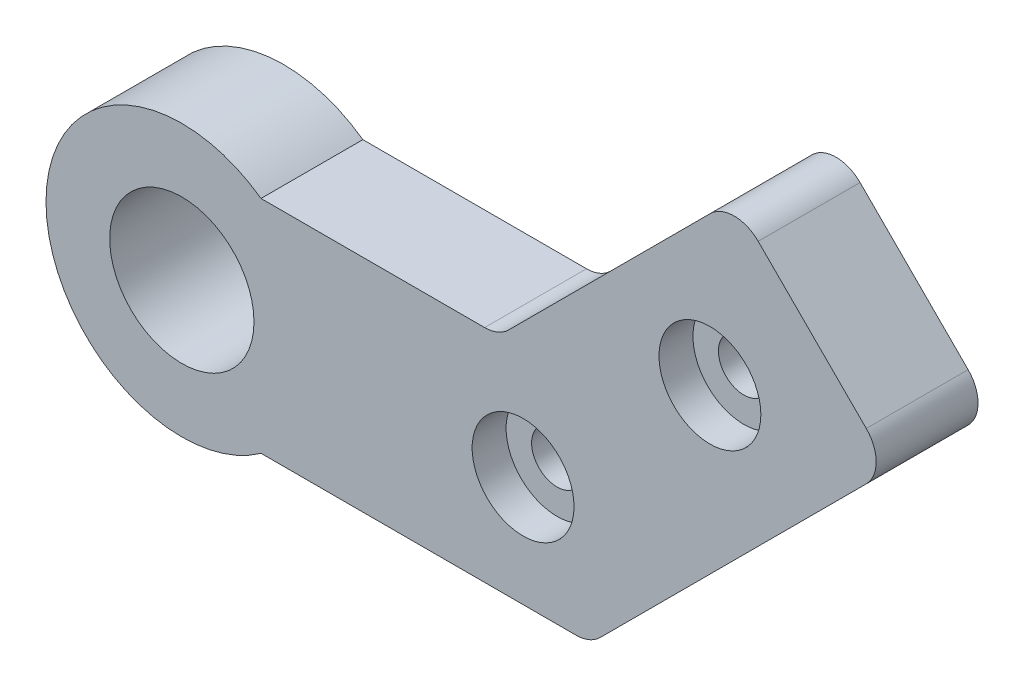
ISO-10303-21;
HEADER;
FILE_DESCRIPTION(('STEP AP214'),'2;1');
FILE_NAME('part.step','',(''),(''),'','','');
FILE_SCHEMA(('AUTOMOTIVE_DESIGN { 1 0 10303 214 1 1 1 1 }'));
ENDSEC;
DATA;
#1=APPLICATION_CONTEXT('core data for automotive mechanical design processes');
#2=APPLICATION_PROTOCOL_DEFINITION('international standard','automotive_design',2000,#1);
#3=PRODUCT_CONTEXT('',#1,'mechanical');
#4=PRODUCT('Part','Part','',(#3));
#5=PRODUCT_RELATED_PRODUCT_CATEGORY('part','',(#4));
#6=PRODUCT_DEFINITION_FORMATION('','',#4);
#7=PRODUCT_DEFINITION_CONTEXT('part definition',#1,'design');
#8=PRODUCT_DEFINITION('design','',#6,#7);
#9=PRODUCT_DEFINITION_SHAPE('','',#8);
#10=(LENGTH_UNIT() NAMED_UNIT(*) SI_UNIT(.MILLI.,.METRE.));
#11=(NAMED_UNIT(*) PLANE_ANGLE_UNIT() SI_UNIT($,.RADIAN.));
#12=(NAMED_UNIT(*) SI_UNIT($,.STERADIAN.) SOLID_ANGLE_UNIT());
#13=UNCERTAINTY_MEASURE_WITH_UNIT(LENGTH_MEASURE(1.E-05),#10,'distance_accuracy_value','');
#14=(GEOMETRIC_REPRESENTATION_CONTEXT(3) GLOBAL_UNCERTAINTY_ASSIGNED_CONTEXT((#13)) GLOBAL_UNIT_ASSIGNED_CONTEXT((#10,
#11,#12)) REPRESENTATION_CONTEXT('',''));
#15=CARTESIAN_POINT('',(0.,0.,0.));
#16=DIRECTION('',(0.,0.,1.));
#17=DIRECTION('',(1.,0.,0.));
#18=AXIS2_PLACEMENT_3D('',#15,#16,#17);
#19=CARTESIAN_POINT('',(9.72889778547104,9.35031688535954,0.));
#20=DIRECTION('',(0.,0.,1.));
#21=DIRECTION('',(1.,0.,0.));
#22=AXIS2_PLACEMENT_3D('',#19,#20,#21);
#23=CYLINDRICAL_SURFACE('',#22,1.5);
#24=CARTESIAN_POINT('',(9.72889778547104,9.35031688535954,0.));
#25=DIRECTION('',(0.,0.,1.));
#26=DIRECTION('',(1.,0.,0.));
#27=AXIS2_PLACEMENT_3D('',#24,#25,#26);
#28=CIRCLE('',#27,1.5);
#29=CARTESIAN_POINT('',(11.228897785471,9.35031688535954,0.));
#30=VERTEX_POINT('',#29);
#31=EDGE_CURVE('E177',#30,#30,#28,.T.);
#32=ORIENTED_EDGE('',*,*,#31,.F.);
#33=EDGE_LOOP('',(#32));
#34=FACE_BOUND('',#33,.T.);
#35=CARTESIAN_POINT('',(9.72889778547104,9.35031688535954,4.));
#36=DIRECTION('',(0.,0.,1.));
#37=DIRECTION('',(1.,0.,0.));
#38=AXIS2_PLACEMENT_3D('',#35,#36,#37);
#39=CIRCLE('',#38,1.5);
#40=CARTESIAN_POINT('',(11.228897785471,9.35031688535954,4.));
#41=VERTEX_POINT('',#40);
#42=EDGE_CURVE('E39',#41,#41,#39,.F.);
#43=ORIENTED_EDGE('',*,*,#42,.F.);
#44=EDGE_LOOP('',(#43));
#45=FACE_BOUND('',#44,.T.);
#46=ADVANCED_FACE('F35',(#34,#45),#23,.F.);
#47=CARTESIAN_POINT('',(-1.2757727680621,-0.842681986817409,0.));
#48=DIRECTION('',(0.,0.,1.));
#49=DIRECTION('',(1.,0.,0.));
#50=AXIS2_PLACEMENT_3D('',#47,#48,#49);
#51=CYLINDRICAL_SURFACE('',#50,1.5);
#52=CARTESIAN_POINT('',(-1.2757727680621,-0.842681986817409,0.));
#53=DIRECTION('',(0.,0.,1.));
#54=DIRECTION('',(1.,0.,0.));
#55=AXIS2_PLACEMENT_3D('',#52,#53,#54);
#56=CIRCLE('',#55,1.5);
#57=CARTESIAN_POINT('',(0.224227231937896,-0.842681986817409,0.));
#58=VERTEX_POINT('',#57);
#59=EDGE_CURVE('E182',#58,#58,#56,.T.);
#60=ORIENTED_EDGE('',*,*,#59,.F.);
#61=EDGE_LOOP('',(#60));
#62=FACE_BOUND('',#61,.T.);
#63=CARTESIAN_POINT('',(-1.2757727680621,-0.842681986817409,4.));
#64=DIRECTION('',(0.,0.,1.));
#65=DIRECTION('',(1.,0.,0.));
#66=AXIS2_PLACEMENT_3D('',#63,#64,#65);
#67=CIRCLE('',#66,1.5);
#68=CARTESIAN_POINT('',(0.224227231937896,-0.842681986817409,4.));
#69=VERTEX_POINT('',#68);
#70=EDGE_CURVE('E175',#69,#69,#67,.F.);
#71=ORIENTED_EDGE('',*,*,#70,.F.);
#72=EDGE_LOOP('',(#71));
#73=FACE_BOUND('',#72,.T.);
#74=ADVANCED_FACE('F259',(#62,#73),#51,.F.);
#75=CARTESIAN_POINT('',(-21.3757727680621,-0.84268198681741,6.));
#76=DIRECTION('',(0.,0.,-1.));
#77=DIRECTION('',(-1.,0.,0.));
#78=AXIS2_PLACEMENT_3D('',#75,#76,#77);
#79=CYLINDRICAL_SURFACE('',#78,8.);
#80=CARTESIAN_POINT('',(-21.3757727680621,-0.84268198681741,0.));
#81=DIRECTION('',(0.,0.,1.));
#82=DIRECTION('',(1.,0.,0.));
#83=AXIS2_PLACEMENT_3D('',#80,#81,#82);
#84=CIRCLE('',#83,8.);
#85=CARTESIAN_POINT('',(-16.7120832415177,5.65731801318259,0.));
#86=VERTEX_POINT('',#85);
#87=CARTESIAN_POINT('',(-16.7120832415177,-7.34268198681741,0.));
#88=VERTEX_POINT('',#87);
#89=EDGE_CURVE('E139',#86,#88,#84,.T.);
#90=ORIENTED_EDGE('',*,*,#89,.T.);
#91=DIRECTION('',(0.,0.,-1.));
#92=VECTOR('',#91,1.);
#93=CARTESIAN_POINT('',(-16.7120832415177,-7.34268198681741,6.));
#94=LINE('',#93,#92);
#95=CARTESIAN_POINT('',(-16.7120832415177,-7.34268198681741,6.));
#96=VERTEX_POINT('',#95);
#97=EDGE_CURVE('E120',#96,#88,#94,.T.);
#98=ORIENTED_EDGE('',*,*,#97,.F.);
#99=CARTESIAN_POINT('',(-21.3757727680621,-0.84268198681741,6.));
#100=DIRECTION('',(0.,0.,1.));
#101=DIRECTION('',(1.,0.,0.));
#102=AXIS2_PLACEMENT_3D('',#99,#100,#101);
#103=CIRCLE('',#102,8.);
#104=CARTESIAN_POINT('',(-16.7120832415177,5.65731801318259,6.));
#105=VERTEX_POINT('',#104);
#106=EDGE_CURVE('E126',#105,#96,#103,.T.);
#107=ORIENTED_EDGE('',*,*,#106,.F.);
#108=DIRECTION('',(0.,0.,-1.));
#109=VECTOR('',#108,1.);
#110=CARTESIAN_POINT('',(-16.7120832415177,5.65731801318259,6.));
#111=LINE('',#110,#109);
#112=EDGE_CURVE('E141',#105,#86,#111,.T.);
#113=ORIENTED_EDGE('',*,*,#112,.T.);
#114=EDGE_LOOP('',(#90,#98,#107,#113));
#115=FACE_BOUND('',#114,.T.);
#116=ADVANCED_FACE('F137',(#115),#79,.T.);
#117=CARTESIAN_POINT('',(-16.7120832415177,-7.34268198681741,6.));
#118=DIRECTION('',(0.,1.,0.));
#119=DIRECTION('',(-1.,0.,0.));
#120=AXIS2_PLACEMENT_3D('',#117,#118,#119);
#121=PLANE('',#120);
#122=DIRECTION('',(1.,0.,0.));
#123=VECTOR('',#122,1.);
#124=CARTESIAN_POINT('',(-16.7120832415177,-7.34268198681741,0.));
#125=LINE('',#124,#123);
#126=CARTESIAN_POINT('',(1.84426594458633,-7.34268198681741,0.));
#127=VERTEX_POINT('',#126);
#128=EDGE_CURVE('E210',#88,#127,#125,.T.);
#129=ORIENTED_EDGE('',*,*,#128,.T.);
#130=DIRECTION('',(0.,0.,-1.));
#131=VECTOR('',#130,1.);
#132=CARTESIAN_POINT('',(1.84426594458634,-7.34268198681741,6.));
#133=LINE('',#132,#131);
#134=CARTESIAN_POINT('',(1.84426594458633,-7.34268198681741,6.));
#135=VERTEX_POINT('',#134);
#136=EDGE_CURVE('E123',#127,#135,#133,.F.);
#137=ORIENTED_EDGE('',*,*,#136,.T.);
#138=DIRECTION('',(1.,0.,0.));
#139=VECTOR('',#138,1.);
#140=CARTESIAN_POINT('',(-16.7120832415177,-7.34268198681741,6.));
#141=LINE('',#140,#139);
#142=EDGE_CURVE('E115',#96,#135,#141,.T.);
#143=ORIENTED_EDGE('',*,*,#142,.F.);
#144=ORIENTED_EDGE('',*,*,#97,.T.);
#145=EDGE_LOOP('',(#129,#137,#143,#144));
#146=FACE_BOUND('',#145,.T.);
#147=ADVANCED_FACE('F118',(#146),#121,.F.);
#148=CARTESIAN_POINT('',(2.67269306933252,-7.34268198681741,6.));
#149=DIRECTION('',(-0.707106781186546,0.707106781186549,0.));
#150=DIRECTION('',(-0.707106781186549,-0.707106781186546,0.));
#151=AXIS2_PLACEMENT_3D('',#148,#149,#150);
#152=PLANE('',#151);
#153=DIRECTION('',(0.707106781186549,0.707106781186546,0.));
#154=VECTOR('',#153,1.);
#155=CARTESIAN_POINT('',(2.67269306933252,-7.34268198681741,0.));
#156=LINE('',#155,#154);
#157=CARTESIAN_POINT('',(3.25847950695943,-6.75689554919051,0.));
#158=VERTEX_POINT('',#157);
#159=CARTESIAN_POINT('',(18.9361490366231,8.92077398047315,0.));
#160=VERTEX_POINT('',#159);
#161=EDGE_CURVE('E212',#158,#160,#156,.T.);
#162=ORIENTED_EDGE('',*,*,#161,.T.);
#163=DIRECTION('',(0.,0.,-1.));
#164=VECTOR('',#163,1.);
#165=CARTESIAN_POINT('',(18.9361490366231,8.92077398047316,6.));
#166=LINE('',#165,#164);
#167=CARTESIAN_POINT('',(18.9361490366231,8.92077398047315,6.));
#168=VERTEX_POINT('',#167);
#169=EDGE_CURVE('E58',#160,#168,#166,.F.);
#170=ORIENTED_EDGE('',*,*,#169,.T.);
#171=DIRECTION('',(0.707106781186549,0.707106781186546,0.));
#172=VECTOR('',#171,1.);
#173=CARTESIAN_POINT('',(2.67269306933252,-7.34268198681741,6.));
#174=LINE('',#173,#172);
#175=CARTESIAN_POINT('',(3.25847950695943,-6.75689554919051,6.));
#176=VERTEX_POINT('',#175);
#177=EDGE_CURVE('E125',#176,#168,#174,.T.);
#178=ORIENTED_EDGE('',*,*,#177,.F.);
#179=DIRECTION('',(0.,0.,-1.));
#180=VECTOR('',#179,1.);
#181=CARTESIAN_POINT('',(3.25847950695943,-6.75689554919051,6.));
#182=LINE('',#181,#180);
#183=EDGE_CURVE('E167',#176,#158,#182,.T.);
#184=ORIENTED_EDGE('',*,*,#183,.T.);
#185=EDGE_LOOP('',(#162,#170,#178,#184));
#186=FACE_BOUND('',#185,.T.);
#187=ADVANCED_FACE('F231',(#186),#152,.F.);
#188=CARTESIAN_POINT('',(11.1579744435711,19.5273756982714,6.));
#189=DIRECTION('',(-0.707106781186549,-0.707106781186546,0.));
#190=DIRECTION('',(0.707106781186546,-0.707106781186549,0.));
#191=AXIS2_PLACEMENT_3D('',#188,#189,#190);
#192=PLANE('',#191);
#193=DIRECTION('',(-0.707106781186546,0.707106781186549,0.));
#194=VECTOR('',#193,1.);
#195=CARTESIAN_POINT('',(11.1579744435711,19.5273756982714,0.));
#196=LINE('',#195,#194);
#197=CARTESIAN_POINT('',(18.9361490366231,11.7492011052193,0.));
#198=VERTEX_POINT('',#197);
#199=CARTESIAN_POINT('',(12.5721880059442,18.1131621358983,0.));
#200=VERTEX_POINT('',#199);
#201=EDGE_CURVE('E214',#198,#200,#196,.T.);
#202=ORIENTED_EDGE('',*,*,#201,.T.);
#203=DIRECTION('',(0.,0.,-1.));
#204=VECTOR('',#203,1.);
#205=CARTESIAN_POINT('',(12.5721880059442,18.1131621358983,6.));
#206=LINE('',#205,#204);
#207=CARTESIAN_POINT('',(12.5721880059442,18.1131621358983,6.));
#208=VERTEX_POINT('',#207);
#209=EDGE_CURVE('E159',#200,#208,#206,.F.);
#210=ORIENTED_EDGE('',*,*,#209,.T.);
#211=DIRECTION('',(-0.707106781186546,0.707106781186549,0.));
#212=VECTOR('',#211,1.);
#213=CARTESIAN_POINT('',(11.1579744435711,19.5273756982714,6.));
#214=LINE('',#213,#212);
#215=CARTESIAN_POINT('',(18.9361490366231,11.7492011052193,6.));
#216=VERTEX_POINT('',#215);
#217=EDGE_CURVE('E204',#216,#208,#214,.T.);
#218=ORIENTED_EDGE('',*,*,#217,.F.);
#219=DIRECTION('',(0.,0.,-1.));
#220=VECTOR('',#219,1.);
#221=CARTESIAN_POINT('',(18.9361490366231,11.7492011052193,6.));
#222=LINE('',#221,#220);
#223=EDGE_CURVE('E156',#216,#198,#222,.T.);
#224=ORIENTED_EDGE('',*,*,#223,.T.);
#225=EDGE_LOOP('',(#202,#210,#218,#224));
#226=FACE_BOUND('',#225,.T.);
#227=ADVANCED_FACE('F238',(#226),#192,.F.);
#228=CARTESIAN_POINT('',(-2.7120832415177,5.65731801318259,6.));
#229=DIRECTION('',(0.707106781186546,-0.707106781186549,0.));
#230=DIRECTION('',(0.707106781186549,0.707106781186546,0.));
#231=AXIS2_PLACEMENT_3D('',#228,#229,#230);
#232=PLANE('',#231);
#233=DIRECTION('',(-0.707106781186549,-0.707106781186546,0.));
#234=VECTOR('',#233,1.);
#235=CARTESIAN_POINT('',(-2.7120832415177,5.65731801318259,6.));
#236=LINE('',#235,#234);
#237=CARTESIAN_POINT('',(9.74376088119804,18.1131621358983,6.));
#238=VERTEX_POINT('',#237);
#239=CARTESIAN_POINT('',(-2.12629680389079,6.24310445080949,6.));
#240=VERTEX_POINT('',#239);
#241=EDGE_CURVE('E206',#238,#240,#236,.T.);
#242=ORIENTED_EDGE('',*,*,#241,.F.);
#243=DIRECTION('',(0.,0.,-1.));
#244=VECTOR('',#243,1.);
#245=CARTESIAN_POINT('',(9.74376088119804,18.1131621358983,6.));
#246=LINE('',#245,#244);
#247=CARTESIAN_POINT('',(9.74376088119804,18.1131621358983,0.));
#248=VERTEX_POINT('',#247);
#249=EDGE_CURVE('E143',#238,#248,#246,.T.);
#250=ORIENTED_EDGE('',*,*,#249,.T.);
#251=DIRECTION('',(-0.707106781186549,-0.707106781186546,0.));
#252=VECTOR('',#251,1.);
#253=CARTESIAN_POINT('',(-2.7120832415177,5.65731801318259,0.));
#254=LINE('',#253,#252);
#255=CARTESIAN_POINT('',(-2.12629680389079,6.24310445080949,0.));
#256=VERTEX_POINT('',#255);
#257=EDGE_CURVE('E217',#248,#256,#254,.T.);
#258=ORIENTED_EDGE('',*,*,#257,.T.);
#259=DIRECTION('',(0.,0.,-1.));
#260=VECTOR('',#259,1.);
#261=CARTESIAN_POINT('',(-2.12629680389079,6.24310445080949,6.));
#262=LINE('',#261,#260);
#263=EDGE_CURVE('E140',#256,#240,#262,.F.);
#264=ORIENTED_EDGE('',*,*,#263,.T.);
#265=EDGE_LOOP('',(#242,#250,#258,#264));
#266=FACE_BOUND('',#265,.T.);
#267=ADVANCED_FACE('F246',(#266),#232,.F.);
#268=CARTESIAN_POINT('',(-16.7120832415177,5.65731801318259,6.));
#269=DIRECTION('',(0.,-1.,0.));
#270=DIRECTION('',(0.,0.,-1.));
#271=AXIS2_PLACEMENT_3D('',#268,#269,#270);
#272=PLANE('',#271);
#273=DIRECTION('',(-1.,0.,0.));
#274=VECTOR('',#273,1.);
#275=CARTESIAN_POINT('',(-16.7120832415177,5.65731801318259,6.));
#276=LINE('',#275,#274);
#277=CARTESIAN_POINT('',(-3.54051036626388,5.65731801318259,6.));
#278=VERTEX_POINT('',#277);
#279=EDGE_CURVE('E131',#278,#105,#276,.T.);
#280=ORIENTED_EDGE('',*,*,#279,.F.);
#281=DIRECTION('',(0.,0.,-1.));
#282=VECTOR('',#281,1.);
#283=CARTESIAN_POINT('',(-3.54051036626388,5.65731801318259,0.));
#284=LINE('',#283,#282);
#285=CARTESIAN_POINT('',(-3.54051036626388,5.65731801318259,0.));
#286=VERTEX_POINT('',#285);
#287=EDGE_CURVE('E172',#278,#286,#284,.T.);
#288=ORIENTED_EDGE('',*,*,#287,.T.);
#289=DIRECTION('',(-1.,0.,0.));
#290=VECTOR('',#289,1.);
#291=CARTESIAN_POINT('',(-16.7120832415177,5.65731801318259,0.));
#292=LINE('',#291,#290);
#293=EDGE_CURVE('E135',#286,#86,#292,.T.);
#294=ORIENTED_EDGE('',*,*,#293,.T.);
#295=ORIENTED_EDGE('',*,*,#112,.F.);
#296=EDGE_LOOP('',(#280,#288,#294,#295));
#297=FACE_BOUND('',#296,.T.);
#298=ADVANCED_FACE('F221',(#297),#272,.F.);
#299=CARTESIAN_POINT('',(-21.3757727680621,-0.84268198681741,6.));
#300=DIRECTION('',(0.,0.,1.));
#301=DIRECTION('',(1.,0.,0.));
#302=AXIS2_PLACEMENT_3D('',#299,#300,#301);
#303=PLANE('',#302);
#304=CARTESIAN_POINT('',(9.72889778547104,9.35031688535954,6.));
#305=DIRECTION('',(0.,0.,1.));
#306=DIRECTION('',(1.,0.,0.));
#307=AXIS2_PLACEMENT_3D('',#304,#305,#306);
#308=CIRCLE('',#307,3.);
#309=CARTESIAN_POINT('',(12.728897785471,9.35031688535954,6.));
#310=VERTEX_POINT('',#309);
#311=EDGE_CURVE('E192',#310,#310,#308,.T.);
#312=ORIENTED_EDGE('',*,*,#311,.F.);
#313=EDGE_LOOP('',(#312));
#314=FACE_BOUND('',#313,.T.);
#315=CARTESIAN_POINT('',(-1.2757727680621,-0.842681986817409,6.));
#316=DIRECTION('',(0.,0.,1.));
#317=DIRECTION('',(1.,0.,0.));
#318=AXIS2_PLACEMENT_3D('',#315,#316,#317);
#319=CIRCLE('',#318,3.);
#320=CARTESIAN_POINT('',(1.7242272319379,-0.842681986817409,6.));
#321=VERTEX_POINT('',#320);
#322=EDGE_CURVE('E185',#321,#321,#319,.T.);
#323=ORIENTED_EDGE('',*,*,#322,.F.);
#324=EDGE_LOOP('',(#323));
#325=FACE_BOUND('',#324,.T.);
#326=CARTESIAN_POINT('',(-21.3757727680621,-0.842681986817409,6.));
#327=DIRECTION('',(0.,0.,1.));
#328=DIRECTION('',(1.,0.,0.));
#329=AXIS2_PLACEMENT_3D('',#326,#327,#328);
#330=CIRCLE('',#329,4.25);
#331=CARTESIAN_POINT('',(-17.1257727680621,-0.842681986817409,6.));
#332=VERTEX_POINT('',#331);
#333=EDGE_CURVE('E197',#332,#332,#330,.T.);
#334=ORIENTED_EDGE('',*,*,#333,.F.);
#335=EDGE_LOOP('',(#334));
#336=FACE_BOUND('',#335,.T.);
#337=ORIENTED_EDGE('',*,*,#217,.T.);
#338=CARTESIAN_POINT('',(11.1579744435711,16.6989485735252,6.));
#339=DIRECTION('',(0.,0.,1.));
#340=DIRECTION('',(1.,0.,0.));
#341=AXIS2_PLACEMENT_3D('',#338,#339,#340);
#342=CIRCLE('',#341,2.);
#343=EDGE_CURVE('E165',#208,#238,#342,.T.);
#344=ORIENTED_EDGE('',*,*,#343,.T.);
#345=ORIENTED_EDGE('',*,*,#241,.T.);
#346=CARTESIAN_POINT('',(-3.54051036626388,7.65731801318259,6.));
#347=DIRECTION('',(0.,0.,1.));
#348=DIRECTION('',(1.,0.,0.));
#349=AXIS2_PLACEMENT_3D('',#346,#347,#348);
#350=CIRCLE('',#349,2.);
#351=EDGE_CURVE('E11',#240,#278,#350,.F.);
#352=ORIENTED_EDGE('',*,*,#351,.T.);
#353=ORIENTED_EDGE('',*,*,#279,.T.);
#354=ORIENTED_EDGE('',*,*,#106,.T.);
#355=ORIENTED_EDGE('',*,*,#142,.T.);
#356=CARTESIAN_POINT('',(1.84426594458634,-5.34268198681741,6.));
#357=DIRECTION('',(0.,0.,1.));
#358=DIRECTION('',(1.,0.,0.));
#359=AXIS2_PLACEMENT_3D('',#356,#357,#358);
#360=CIRCLE('',#359,2.);
#361=EDGE_CURVE('E161',#135,#176,#360,.T.);
#362=ORIENTED_EDGE('',*,*,#361,.T.);
#363=ORIENTED_EDGE('',*,*,#177,.T.);
#364=CARTESIAN_POINT('',(17.52193547425,10.3349875428463,6.));
#365=DIRECTION('',(0.,0.,1.));
#366=DIRECTION('',(1.,0.,0.));
#367=AXIS2_PLACEMENT_3D('',#364,#365,#366);
#368=CIRCLE('',#367,2.);
#369=EDGE_CURVE('E163',#168,#216,#368,.T.);
#370=ORIENTED_EDGE('',*,*,#369,.T.);
#371=EDGE_LOOP('',(#337,#344,#345,#352,#353,#354,#355,#362,#363,#370));
#372=FACE_BOUND('',#371,.T.);
#373=ADVANCED_FACE('F130',(#314,#325,#336,#372),#303,.T.);
#374=CARTESIAN_POINT('',(-21.3757727680621,-0.84268198681741,0.));
#375=DIRECTION('',(0.,0.,1.));
#376=DIRECTION('',(1.,0.,0.));
#377=AXIS2_PLACEMENT_3D('',#374,#375,#376);
#378=PLANE('',#377);
#379=ORIENTED_EDGE('',*,*,#31,.T.);
#380=EDGE_LOOP('',(#379));
#381=FACE_BOUND('',#380,.T.);
#382=ORIENTED_EDGE('',*,*,#59,.T.);
#383=EDGE_LOOP('',(#382));
#384=FACE_BOUND('',#383,.T.);
#385=CARTESIAN_POINT('',(-21.3757727680621,-0.842681986817409,0.));
#386=DIRECTION('',(0.,0.,1.));
#387=DIRECTION('',(1.,0.,0.));
#388=AXIS2_PLACEMENT_3D('',#385,#386,#387);
#389=CIRCLE('',#388,4.25);
#390=CARTESIAN_POINT('',(-17.1257727680621,-0.842681986817409,0.));
#391=VERTEX_POINT('',#390);
#392=EDGE_CURVE('E198',#391,#391,#389,.T.);
#393=ORIENTED_EDGE('',*,*,#392,.T.);
#394=EDGE_LOOP('',(#393));
#395=FACE_BOUND('',#394,.T.);
#396=ORIENTED_EDGE('',*,*,#257,.F.);
#397=CARTESIAN_POINT('',(11.1579744435711,16.6989485735252,0.));
#398=DIRECTION('',(0.,0.,1.));
#399=DIRECTION('',(1.,0.,0.));
#400=AXIS2_PLACEMENT_3D('',#397,#398,#399);
#401=CIRCLE('',#400,2.);
#402=EDGE_CURVE('E154',#248,#200,#401,.F.);
#403=ORIENTED_EDGE('',*,*,#402,.T.);
#404=ORIENTED_EDGE('',*,*,#201,.F.);
#405=CARTESIAN_POINT('',(17.52193547425,10.3349875428463,0.));
#406=DIRECTION('',(0.,0.,1.));
#407=DIRECTION('',(1.,0.,0.));
#408=AXIS2_PLACEMENT_3D('',#405,#406,#407);
#409=CIRCLE('',#408,2.);
#410=EDGE_CURVE('E152',#198,#160,#409,.F.);
#411=ORIENTED_EDGE('',*,*,#410,.T.);
#412=ORIENTED_EDGE('',*,*,#161,.F.);
#413=CARTESIAN_POINT('',(1.84426594458634,-5.34268198681741,0.));
#414=DIRECTION('',(0.,0.,1.));
#415=DIRECTION('',(1.,0.,0.));
#416=AXIS2_PLACEMENT_3D('',#413,#414,#415);
#417=CIRCLE('',#416,2.);
#418=EDGE_CURVE('E150',#158,#127,#417,.F.);
#419=ORIENTED_EDGE('',*,*,#418,.T.);
#420=ORIENTED_EDGE('',*,*,#128,.F.);
#421=ORIENTED_EDGE('',*,*,#89,.F.);
#422=ORIENTED_EDGE('',*,*,#293,.F.);
#423=CARTESIAN_POINT('',(-3.54051036626388,7.65731801318259,0.));
#424=DIRECTION('',(0.,0.,1.));
#425=DIRECTION('',(1.,0.,0.));
#426=AXIS2_PLACEMENT_3D('',#423,#424,#425);
#427=CIRCLE('',#426,2.);
#428=EDGE_CURVE('E44',#286,#256,#427,.T.);
#429=ORIENTED_EDGE('',*,*,#428,.T.);
#430=EDGE_LOOP('',(#396,#403,#404,#411,#412,#419,#420,#421,#422,#429));
#431=FACE_BOUND('',#430,.T.);
#432=ADVANCED_FACE('F225',(#381,#384,#395,#431),#378,.F.);
#433=CARTESIAN_POINT('',(11.1579744435711,16.6989485735252,6.));
#434=DIRECTION('',(0.,0.,-1.));
#435=DIRECTION('',(-1.,0.,0.));
#436=AXIS2_PLACEMENT_3D('',#433,#434,#435);
#437=CYLINDRICAL_SURFACE('',#436,2.);
#438=ORIENTED_EDGE('',*,*,#343,.F.);
#439=ORIENTED_EDGE('',*,*,#209,.F.);
#440=ORIENTED_EDGE('',*,*,#402,.F.);
#441=ORIENTED_EDGE('',*,*,#249,.F.);
#442=EDGE_LOOP('',(#438,#439,#440,#441));
#443=FACE_BOUND('',#442,.T.);
#444=ADVANCED_FACE('F244',(#443),#437,.T.);
#445=CARTESIAN_POINT('',(17.52193547425,10.3349875428463,6.));
#446=DIRECTION('',(0.,0.,-1.));
#447=DIRECTION('',(-1.,0.,0.));
#448=AXIS2_PLACEMENT_3D('',#445,#446,#447);
#449=CYLINDRICAL_SURFACE('',#448,2.);
#450=ORIENTED_EDGE('',*,*,#369,.F.);
#451=ORIENTED_EDGE('',*,*,#169,.F.);
#452=ORIENTED_EDGE('',*,*,#410,.F.);
#453=ORIENTED_EDGE('',*,*,#223,.F.);
#454=EDGE_LOOP('',(#450,#451,#452,#453));
#455=FACE_BOUND('',#454,.T.);
#456=ADVANCED_FACE('F235',(#455),#449,.T.);
#457=CARTESIAN_POINT('',(1.84426594458634,-5.34268198681741,6.));
#458=DIRECTION('',(0.,0.,-1.));
#459=DIRECTION('',(-1.,0.,0.));
#460=AXIS2_PLACEMENT_3D('',#457,#458,#459);
#461=CYLINDRICAL_SURFACE('',#460,2.);
#462=ORIENTED_EDGE('',*,*,#361,.F.);
#463=ORIENTED_EDGE('',*,*,#136,.F.);
#464=ORIENTED_EDGE('',*,*,#418,.F.);
#465=ORIENTED_EDGE('',*,*,#183,.F.);
#466=EDGE_LOOP('',(#462,#463,#464,#465));
#467=FACE_BOUND('',#466,.T.);
#468=ADVANCED_FACE('F228',(#467),#461,.T.);
#469=CARTESIAN_POINT('',(-3.54051036626388,7.65731801318259,6.));
#470=DIRECTION('',(0.,0.,1.));
#471=DIRECTION('',(1.,0.,0.));
#472=AXIS2_PLACEMENT_3D('',#469,#470,#471);
#473=CYLINDRICAL_SURFACE('',#472,2.);
#474=ORIENTED_EDGE('',*,*,#351,.F.);
#475=ORIENTED_EDGE('',*,*,#263,.F.);
#476=ORIENTED_EDGE('',*,*,#428,.F.);
#477=ORIENTED_EDGE('',*,*,#287,.F.);
#478=EDGE_LOOP('',(#474,#475,#476,#477));
#479=FACE_BOUND('',#478,.T.);
#480=ADVANCED_FACE('F37',(#479),#473,.F.);
#481=CARTESIAN_POINT('',(-21.3757727680621,-0.842681986817409,0.));
#482=DIRECTION('',(0.,0.,1.));
#483=DIRECTION('',(1.,0.,0.));
#484=AXIS2_PLACEMENT_3D('',#481,#482,#483);
#485=CYLINDRICAL_SURFACE('',#484,4.25);
#486=ORIENTED_EDGE('',*,*,#392,.F.);
#487=EDGE_LOOP('',(#486));
#488=FACE_BOUND('',#487,.T.);
#489=ORIENTED_EDGE('',*,*,#333,.T.);
#490=EDGE_LOOP('',(#489));
#491=FACE_BOUND('',#490,.T.);
#492=ADVANCED_FACE('F250',(#488,#491),#485,.F.);
#493=CARTESIAN_POINT('',(-1.2757727680621,-0.842681986817409,4.));
#494=DIRECTION('',(0.,0.,1.));
#495=DIRECTION('',(1.,0.,0.));
#496=AXIS2_PLACEMENT_3D('',#493,#494,#495);
#497=PLANE('',#496);
#498=CARTESIAN_POINT('',(-1.2757727680621,-0.842681986817409,4.));
#499=DIRECTION('',(0.,0.,1.));
#500=DIRECTION('',(1.,0.,0.));
#501=AXIS2_PLACEMENT_3D('',#498,#499,#500);
#502=CIRCLE('',#501,3.);
#503=CARTESIAN_POINT('',(1.7242272319379,-0.842681986817409,4.));
#504=VERTEX_POINT('',#503);
#505=EDGE_CURVE('E178',#504,#504,#502,.T.);
#506=ORIENTED_EDGE('',*,*,#505,.T.);
#507=EDGE_LOOP('',(#506));
#508=FACE_BOUND('',#507,.T.);
#509=ORIENTED_EDGE('',*,*,#70,.T.);
#510=EDGE_LOOP('',(#509));
#511=FACE_BOUND('',#510,.T.);
#512=ADVANCED_FACE('F255',(#508,#511),#497,.T.);
#513=CARTESIAN_POINT('',(-1.2757727680621,-0.842681986817409,4.));
#514=DIRECTION('',(0.,0.,1.));
#515=DIRECTION('',(1.,0.,0.));
#516=AXIS2_PLACEMENT_3D('',#513,#514,#515);
#517=CYLINDRICAL_SURFACE('',#516,3.);
#518=ORIENTED_EDGE('',*,*,#505,.F.);
#519=EDGE_LOOP('',(#518));
#520=FACE_BOUND('',#519,.T.);
#521=ORIENTED_EDGE('',*,*,#322,.T.);
#522=EDGE_LOOP('',(#521));
#523=FACE_BOUND('',#522,.T.);
#524=ADVANCED_FACE('F270',(#520,#523),#517,.F.);
#525=CARTESIAN_POINT('',(9.72889778547104,9.35031688535954,4.));
#526=DIRECTION('',(0.,0.,1.));
#527=DIRECTION('',(1.,0.,0.));
#528=AXIS2_PLACEMENT_3D('',#525,#526,#527);
#529=PLANE('',#528);
#530=CARTESIAN_POINT('',(9.72889778547104,9.35031688535954,4.));
#531=DIRECTION('',(0.,0.,1.));
#532=DIRECTION('',(1.,0.,0.));
#533=AXIS2_PLACEMENT_3D('',#530,#531,#532);
#534=CIRCLE('',#533,3.);
#535=CARTESIAN_POINT('',(12.728897785471,9.35031688535954,4.));
#536=VERTEX_POINT('',#535);
#537=EDGE_CURVE('E378',#536,#536,#534,.T.);
#538=ORIENTED_EDGE('',*,*,#537,.T.);
#539=EDGE_LOOP('',(#538));
#540=FACE_BOUND('',#539,.T.);
#541=ORIENTED_EDGE('',*,*,#42,.T.);
#542=EDGE_LOOP('',(#541));
#543=FACE_BOUND('',#542,.T.);
#544=ADVANCED_FACE('F352',(#540,#543),#529,.T.);
#545=CARTESIAN_POINT('',(9.72889778547104,9.35031688535954,4.));
#546=DIRECTION('',(0.,0.,1.));
#547=DIRECTION('',(1.,0.,0.));
#548=AXIS2_PLACEMENT_3D('',#545,#546,#547);
#549=CYLINDRICAL_SURFACE('',#548,3.);
#550=ORIENTED_EDGE('',*,*,#537,.F.);
#551=EDGE_LOOP('',(#550));
#552=FACE_BOUND('',#551,.T.);
#553=ORIENTED_EDGE('',*,*,#311,.T.);
#554=EDGE_LOOP('',(#553));
#555=FACE_BOUND('',#554,.T.);
#556=ADVANCED_FACE('F361',(#552,#555),#549,.F.);
#557=CLOSED_SHELL('',(#46,#74,#116,#147,#187,#227,#267,#298,#373,#432,#444,#456,#468,#480,#492,
#512,#524,#544,#556));
#558=MANIFOLD_SOLID_BREP('B2',#557);
#559=ADVANCED_BREP_SHAPE_REPRESENTATION('',(#18,#558),#14);
#560=SHAPE_DEFINITION_REPRESENTATION(#9,#559);
ENDSEC;
END-ISO-10303-21;
